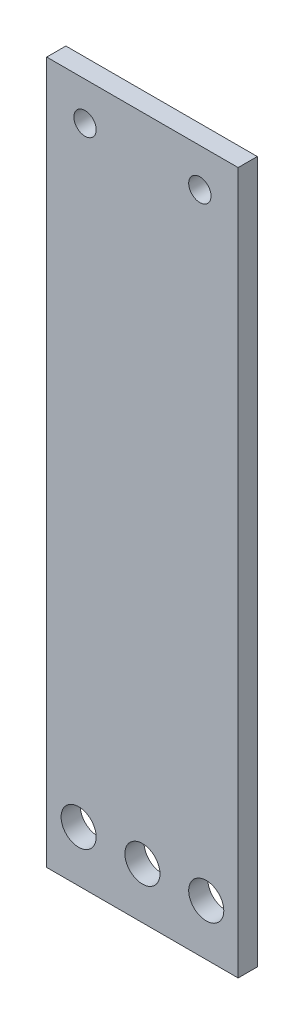
ISO-10303-21;
HEADER;
FILE_DESCRIPTION(('STEP AP214'),'2;1');
FILE_NAME('part.step','',(''),(''),'','','');
FILE_SCHEMA(('AUTOMOTIVE_DESIGN { 1 0 10303 214 1 1 1 1 }'));
ENDSEC;
DATA;
#1=APPLICATION_CONTEXT('core data for automotive mechanical design processes');
#2=APPLICATION_PROTOCOL_DEFINITION('international standard','automotive_design',2000,#1);
#3=PRODUCT_CONTEXT('',#1,'mechanical');
#4=PRODUCT('Part','Part','',(#3));
#5=PRODUCT_RELATED_PRODUCT_CATEGORY('part','',(#4));
#6=PRODUCT_DEFINITION_FORMATION('','',#4);
#7=PRODUCT_DEFINITION_CONTEXT('part definition',#1,'design');
#8=PRODUCT_DEFINITION('design','',#6,#7);
#9=PRODUCT_DEFINITION_SHAPE('','',#8);
#10=(LENGTH_UNIT() NAMED_UNIT(*) SI_UNIT(.MILLI.,.METRE.));
#11=(NAMED_UNIT(*) PLANE_ANGLE_UNIT() SI_UNIT($,.RADIAN.));
#12=(NAMED_UNIT(*) SI_UNIT($,.STERADIAN.) SOLID_ANGLE_UNIT());
#13=UNCERTAINTY_MEASURE_WITH_UNIT(LENGTH_MEASURE(1.E-05),#10,'distance_accuracy_value','');
#14=(GEOMETRIC_REPRESENTATION_CONTEXT(3) GLOBAL_UNCERTAINTY_ASSIGNED_CONTEXT((#13)) GLOBAL_UNIT_ASSIGNED_CONTEXT((#10,
#11,#12)) REPRESENTATION_CONTEXT('',''));
#15=CARTESIAN_POINT('',(0.,0.,0.));
#16=DIRECTION('',(0.,0.,1.));
#17=DIRECTION('',(1.,0.,0.));
#18=AXIS2_PLACEMENT_3D('',#15,#16,#17);
#19=CARTESIAN_POINT('',(0.,0.,3.));
#20=DIRECTION('',(0.,0.,-1.));
#21=DIRECTION('',(-1.,0.,0.));
#22=AXIS2_PLACEMENT_3D('',#19,#20,#21);
#23=PLANE('',#22);
#24=CARTESIAN_POINT('',(-9.,104.,3.));
#25=DIRECTION('',(0.,0.,1.));
#26=DIRECTION('',(1.,0.,0.));
#27=AXIS2_PLACEMENT_3D('',#24,#25,#26);
#28=CIRCLE('',#27,1.75);
#29=CARTESIAN_POINT('',(-7.25,104.,3.));
#30=VERTEX_POINT('',#29);
#31=EDGE_CURVE('E126',#30,#30,#28,.T.);
#32=ORIENTED_EDGE('',*,*,#31,.F.);
#33=EDGE_LOOP('',(#32));
#34=FACE_BOUND('',#33,.T.);
#35=CARTESIAN_POINT('',(0.,8.,3.));
#36=DIRECTION('',(0.,0.,1.));
#37=DIRECTION('',(1.,0.,0.));
#38=AXIS2_PLACEMENT_3D('',#35,#36,#37);
#39=CIRCLE('',#38,2.75);
#40=CARTESIAN_POINT('',(2.75000000000001,8.,3.));
#41=VERTEX_POINT('',#40);
#42=EDGE_CURVE('E114',#41,#41,#39,.T.);
#43=ORIENTED_EDGE('',*,*,#42,.F.);
#44=EDGE_LOOP('',(#43));
#45=FACE_BOUND('',#44,.T.);
#46=DIRECTION('',(0.,-1.,0.));
#47=VECTOR('',#46,1.);
#48=CARTESIAN_POINT('',(-15.,0.,3.));
#49=LINE('',#48,#47);
#50=CARTESIAN_POINT('',(-15.,110.,3.));
#51=VERTEX_POINT('',#50);
#52=CARTESIAN_POINT('',(-15.,0.,3.));
#53=VERTEX_POINT('',#52);
#54=EDGE_CURVE('E84',#51,#53,#49,.T.);
#55=ORIENTED_EDGE('',*,*,#54,.T.);
#56=DIRECTION('',(1.,0.,0.));
#57=VECTOR('',#56,1.);
#58=CARTESIAN_POINT('',(-15.,0.,3.));
#59=LINE('',#58,#57);
#60=CARTESIAN_POINT('',(15.,0.,3.));
#61=VERTEX_POINT('',#60);
#62=EDGE_CURVE('E79',#53,#61,#59,.T.);
#63=ORIENTED_EDGE('',*,*,#62,.T.);
#64=DIRECTION('',(0.,1.,0.));
#65=VECTOR('',#64,1.);
#66=CARTESIAN_POINT('',(15.,0.,3.));
#67=LINE('',#66,#65);
#68=CARTESIAN_POINT('',(15.,110.,3.));
#69=VERTEX_POINT('',#68);
#70=EDGE_CURVE('E82',#61,#69,#67,.T.);
#71=ORIENTED_EDGE('',*,*,#70,.T.);
#72=DIRECTION('',(-1.,0.,0.));
#73=VECTOR('',#72,1.);
#74=CARTESIAN_POINT('',(-15.,110.,3.));
#75=LINE('',#74,#73);
#76=EDGE_CURVE('E49',#69,#51,#75,.T.);
#77=ORIENTED_EDGE('',*,*,#76,.T.);
#78=EDGE_LOOP('',(#55,#63,#71,#77));
#79=FACE_BOUND('',#78,.T.);
#80=CARTESIAN_POINT('',(10.,8.,3.));
#81=DIRECTION('',(0.,0.,1.));
#82=DIRECTION('',(1.,0.,0.));
#83=AXIS2_PLACEMENT_3D('',#80,#81,#82);
#84=CIRCLE('',#83,2.75);
#85=CARTESIAN_POINT('',(12.75,8.,3.));
#86=VERTEX_POINT('',#85);
#87=EDGE_CURVE('E99',#86,#86,#84,.T.);
#88=ORIENTED_EDGE('',*,*,#87,.F.);
#89=EDGE_LOOP('',(#88));
#90=FACE_BOUND('',#89,.T.);
#91=CARTESIAN_POINT('',(-10.,8.,3.));
#92=DIRECTION('',(0.,0.,1.));
#93=DIRECTION('',(1.,0.,0.));
#94=AXIS2_PLACEMENT_3D('',#91,#92,#93);
#95=CIRCLE('',#94,2.75);
#96=CARTESIAN_POINT('',(-7.25,8.,3.));
#97=VERTEX_POINT('',#96);
#98=EDGE_CURVE('E120',#97,#97,#95,.T.);
#99=ORIENTED_EDGE('',*,*,#98,.F.);
#100=EDGE_LOOP('',(#99));
#101=FACE_BOUND('',#100,.T.);
#102=CARTESIAN_POINT('',(9.,104.,3.));
#103=DIRECTION('',(0.,0.,1.));
#104=DIRECTION('',(1.,0.,0.));
#105=AXIS2_PLACEMENT_3D('',#102,#103,#104);
#106=CIRCLE('',#105,1.75);
#107=CARTESIAN_POINT('',(10.75,104.,3.));
#108=VERTEX_POINT('',#107);
#109=EDGE_CURVE('E132',#108,#108,#106,.T.);
#110=ORIENTED_EDGE('',*,*,#109,.F.);
#111=EDGE_LOOP('',(#110));
#112=FACE_BOUND('',#111,.T.);
#113=ADVANCED_FACE('F32',(#34,#45,#79,#90,#101,#112),#23,.F.);
#114=CARTESIAN_POINT('',(0.,0.,0.));
#115=DIRECTION('',(0.,0.,-1.));
#116=DIRECTION('',(-1.,0.,0.));
#117=AXIS2_PLACEMENT_3D('',#114,#115,#116);
#118=PLANE('',#117);
#119=CARTESIAN_POINT('',(-9.,104.,0.));
#120=DIRECTION('',(0.,0.,1.));
#121=DIRECTION('',(1.,0.,0.));
#122=AXIS2_PLACEMENT_3D('',#119,#120,#121);
#123=CIRCLE('',#122,1.75);
#124=CARTESIAN_POINT('',(-7.25,104.,0.));
#125=VERTEX_POINT('',#124);
#126=EDGE_CURVE('E129',#125,#125,#123,.T.);
#127=ORIENTED_EDGE('',*,*,#126,.T.);
#128=EDGE_LOOP('',(#127));
#129=FACE_BOUND('',#128,.T.);
#130=CARTESIAN_POINT('',(0.,8.,0.));
#131=DIRECTION('',(0.,0.,1.));
#132=DIRECTION('',(1.,0.,0.));
#133=AXIS2_PLACEMENT_3D('',#130,#131,#132);
#134=CIRCLE('',#133,2.75);
#135=CARTESIAN_POINT('',(2.75000000000001,8.,0.));
#136=VERTEX_POINT('',#135);
#137=EDGE_CURVE('E117',#136,#136,#134,.T.);
#138=ORIENTED_EDGE('',*,*,#137,.T.);
#139=EDGE_LOOP('',(#138));
#140=FACE_BOUND('',#139,.T.);
#141=DIRECTION('',(0.,-1.,0.));
#142=VECTOR('',#141,1.);
#143=CARTESIAN_POINT('',(-15.,0.,0.));
#144=LINE('',#143,#142);
#145=CARTESIAN_POINT('',(-15.,110.,0.));
#146=VERTEX_POINT('',#145);
#147=CARTESIAN_POINT('',(-15.,0.,0.));
#148=VERTEX_POINT('',#147);
#149=EDGE_CURVE('E96',#146,#148,#144,.T.);
#150=ORIENTED_EDGE('',*,*,#149,.F.);
#151=DIRECTION('',(-1.,0.,0.));
#152=VECTOR('',#151,1.);
#153=CARTESIAN_POINT('',(-15.,110.,0.));
#154=LINE('',#153,#152);
#155=CARTESIAN_POINT('',(15.,110.,0.));
#156=VERTEX_POINT('',#155);
#157=EDGE_CURVE('E72',#156,#146,#154,.T.);
#158=ORIENTED_EDGE('',*,*,#157,.F.);
#159=DIRECTION('',(0.,1.,0.));
#160=VECTOR('',#159,1.);
#161=CARTESIAN_POINT('',(15.,0.,0.));
#162=LINE('',#161,#160);
#163=CARTESIAN_POINT('',(15.,0.,0.));
#164=VERTEX_POINT('',#163);
#165=EDGE_CURVE('E66',#164,#156,#162,.T.);
#166=ORIENTED_EDGE('',*,*,#165,.F.);
#167=DIRECTION('',(1.,0.,0.));
#168=VECTOR('',#167,1.);
#169=CARTESIAN_POINT('',(-15.,0.,0.));
#170=LINE('',#169,#168);
#171=EDGE_CURVE('E88',#148,#164,#170,.T.);
#172=ORIENTED_EDGE('',*,*,#171,.F.);
#173=EDGE_LOOP('',(#150,#158,#166,#172));
#174=FACE_BOUND('',#173,.T.);
#175=CARTESIAN_POINT('',(10.,8.,0.));
#176=DIRECTION('',(0.,0.,1.));
#177=DIRECTION('',(1.,0.,0.));
#178=AXIS2_PLACEMENT_3D('',#175,#176,#177);
#179=CIRCLE('',#178,2.75);
#180=CARTESIAN_POINT('',(12.75,8.,0.));
#181=VERTEX_POINT('',#180);
#182=EDGE_CURVE('E111',#181,#181,#179,.T.);
#183=ORIENTED_EDGE('',*,*,#182,.T.);
#184=EDGE_LOOP('',(#183));
#185=FACE_BOUND('',#184,.T.);
#186=CARTESIAN_POINT('',(-10.,8.,0.));
#187=DIRECTION('',(0.,0.,1.));
#188=DIRECTION('',(1.,0.,0.));
#189=AXIS2_PLACEMENT_3D('',#186,#187,#188);
#190=CIRCLE('',#189,2.75);
#191=CARTESIAN_POINT('',(-7.25,8.,0.));
#192=VERTEX_POINT('',#191);
#193=EDGE_CURVE('E123',#192,#192,#190,.T.);
#194=ORIENTED_EDGE('',*,*,#193,.T.);
#195=EDGE_LOOP('',(#194));
#196=FACE_BOUND('',#195,.T.);
#197=CARTESIAN_POINT('',(9.,104.,0.));
#198=DIRECTION('',(0.,0.,1.));
#199=DIRECTION('',(1.,0.,0.));
#200=AXIS2_PLACEMENT_3D('',#197,#198,#199);
#201=CIRCLE('',#200,1.75);
#202=CARTESIAN_POINT('',(10.75,104.,0.));
#203=VERTEX_POINT('',#202);
#204=EDGE_CURVE('E135',#203,#203,#201,.T.);
#205=ORIENTED_EDGE('',*,*,#204,.T.);
#206=EDGE_LOOP('',(#205));
#207=FACE_BOUND('',#206,.T.);
#208=ADVANCED_FACE('F107',(#129,#140,#174,#185,#196,#207),#118,.T.);
#209=CARTESIAN_POINT('',(-15.,0.,3.));
#210=DIRECTION('',(1.,0.,0.));
#211=DIRECTION('',(0.,0.,-1.));
#212=AXIS2_PLACEMENT_3D('',#209,#210,#211);
#213=PLANE('',#212);
#214=ORIENTED_EDGE('',*,*,#149,.T.);
#215=DIRECTION('',(0.,0.,-1.));
#216=VECTOR('',#215,1.);
#217=CARTESIAN_POINT('',(-15.,0.,3.));
#218=LINE('',#217,#216);
#219=EDGE_CURVE('E11',#53,#148,#218,.T.);
#220=ORIENTED_EDGE('',*,*,#219,.F.);
#221=ORIENTED_EDGE('',*,*,#54,.F.);
#222=DIRECTION('',(0.,0.,-1.));
#223=VECTOR('',#222,1.);
#224=CARTESIAN_POINT('',(-15.,110.,3.));
#225=LINE('',#224,#223);
#226=EDGE_CURVE('E92',#51,#146,#225,.T.);
#227=ORIENTED_EDGE('',*,*,#226,.T.);
#228=EDGE_LOOP('',(#214,#220,#221,#227));
#229=FACE_BOUND('',#228,.T.);
#230=ADVANCED_FACE('F34',(#229),#213,.F.);
#231=CARTESIAN_POINT('',(-15.,0.,3.));
#232=DIRECTION('',(0.,1.,0.));
#233=DIRECTION('',(0.,0.,1.));
#234=AXIS2_PLACEMENT_3D('',#231,#232,#233);
#235=PLANE('',#234);
#236=ORIENTED_EDGE('',*,*,#171,.T.);
#237=DIRECTION('',(0.,0.,-1.));
#238=VECTOR('',#237,1.);
#239=CARTESIAN_POINT('',(15.,0.,3.));
#240=LINE('',#239,#238);
#241=EDGE_CURVE('E41',#61,#164,#240,.T.);
#242=ORIENTED_EDGE('',*,*,#241,.F.);
#243=ORIENTED_EDGE('',*,*,#62,.F.);
#244=ORIENTED_EDGE('',*,*,#219,.T.);
#245=EDGE_LOOP('',(#236,#242,#243,#244));
#246=FACE_BOUND('',#245,.T.);
#247=ADVANCED_FACE('F87',(#246),#235,.F.);
#248=CARTESIAN_POINT('',(15.,0.,3.));
#249=DIRECTION('',(-1.,0.,0.));
#250=DIRECTION('',(0.,0.,1.));
#251=AXIS2_PLACEMENT_3D('',#248,#249,#250);
#252=PLANE('',#251);
#253=ORIENTED_EDGE('',*,*,#165,.T.);
#254=DIRECTION('',(0.,0.,-1.));
#255=VECTOR('',#254,1.);
#256=CARTESIAN_POINT('',(15.,110.,3.));
#257=LINE('',#256,#255);
#258=EDGE_CURVE('E89',#69,#156,#257,.T.);
#259=ORIENTED_EDGE('',*,*,#258,.F.);
#260=ORIENTED_EDGE('',*,*,#70,.F.);
#261=ORIENTED_EDGE('',*,*,#241,.T.);
#262=EDGE_LOOP('',(#253,#259,#260,#261));
#263=FACE_BOUND('',#262,.T.);
#264=ADVANCED_FACE('F90',(#263),#252,.F.);
#265=CARTESIAN_POINT('',(-15.,110.,3.));
#266=DIRECTION('',(0.,-1.,0.));
#267=DIRECTION('',(0.,0.,-1.));
#268=AXIS2_PLACEMENT_3D('',#265,#266,#267);
#269=PLANE('',#268);
#270=ORIENTED_EDGE('',*,*,#157,.T.);
#271=ORIENTED_EDGE('',*,*,#226,.F.);
#272=ORIENTED_EDGE('',*,*,#76,.F.);
#273=ORIENTED_EDGE('',*,*,#258,.T.);
#274=EDGE_LOOP('',(#270,#271,#272,#273));
#275=FACE_BOUND('',#274,.T.);
#276=ADVANCED_FACE('F104',(#275),#269,.F.);
#277=CARTESIAN_POINT('',(10.,8.,3.));
#278=DIRECTION('',(0.,0.,-1.));
#279=DIRECTION('',(-1.,0.,0.));
#280=AXIS2_PLACEMENT_3D('',#277,#278,#279);
#281=CYLINDRICAL_SURFACE('',#280,2.75);
#282=ORIENTED_EDGE('',*,*,#87,.T.);
#283=EDGE_LOOP('',(#282));
#284=FACE_BOUND('',#283,.T.);
#285=ORIENTED_EDGE('',*,*,#182,.F.);
#286=EDGE_LOOP('',(#285));
#287=FACE_BOUND('',#286,.T.);
#288=ADVANCED_FACE('F155',(#284,#287),#281,.F.);
#289=CARTESIAN_POINT('',(0.,8.,3.));
#290=DIRECTION('',(0.,0.,-1.));
#291=DIRECTION('',(-1.,0.,0.));
#292=AXIS2_PLACEMENT_3D('',#289,#290,#291);
#293=CYLINDRICAL_SURFACE('',#292,2.75);
#294=ORIENTED_EDGE('',*,*,#42,.T.);
#295=EDGE_LOOP('',(#294));
#296=FACE_BOUND('',#295,.T.);
#297=ORIENTED_EDGE('',*,*,#137,.F.);
#298=EDGE_LOOP('',(#297));
#299=FACE_BOUND('',#298,.T.);
#300=ADVANCED_FACE('F201',(#296,#299),#293,.F.);
#301=CARTESIAN_POINT('',(-10.,8.,3.));
#302=DIRECTION('',(0.,0.,-1.));
#303=DIRECTION('',(-1.,0.,0.));
#304=AXIS2_PLACEMENT_3D('',#301,#302,#303);
#305=CYLINDRICAL_SURFACE('',#304,2.75);
#306=ORIENTED_EDGE('',*,*,#98,.T.);
#307=EDGE_LOOP('',(#306));
#308=FACE_BOUND('',#307,.T.);
#309=ORIENTED_EDGE('',*,*,#193,.F.);
#310=EDGE_LOOP('',(#309));
#311=FACE_BOUND('',#310,.T.);
#312=ADVANCED_FACE('F209',(#308,#311),#305,.F.);
#313=CARTESIAN_POINT('',(-9.,104.,3.));
#314=DIRECTION('',(0.,0.,-1.));
#315=DIRECTION('',(-1.,0.,0.));
#316=AXIS2_PLACEMENT_3D('',#313,#314,#315);
#317=CYLINDRICAL_SURFACE('',#316,1.75);
#318=ORIENTED_EDGE('',*,*,#31,.T.);
#319=EDGE_LOOP('',(#318));
#320=FACE_BOUND('',#319,.T.);
#321=ORIENTED_EDGE('',*,*,#126,.F.);
#322=EDGE_LOOP('',(#321));
#323=FACE_BOUND('',#322,.T.);
#324=ADVANCED_FACE('F217',(#320,#323),#317,.F.);
#325=CARTESIAN_POINT('',(9.,104.,3.));
#326=DIRECTION('',(0.,0.,-1.));
#327=DIRECTION('',(-1.,0.,0.));
#328=AXIS2_PLACEMENT_3D('',#325,#326,#327);
#329=CYLINDRICAL_SURFACE('',#328,1.75);
#330=ORIENTED_EDGE('',*,*,#109,.T.);
#331=EDGE_LOOP('',(#330));
#332=FACE_BOUND('',#331,.T.);
#333=ORIENTED_EDGE('',*,*,#204,.F.);
#334=EDGE_LOOP('',(#333));
#335=FACE_BOUND('',#334,.T.);
#336=ADVANCED_FACE('F141',(#332,#335),#329,.F.);
#337=CLOSED_SHELL('',(#113,#208,#230,#247,#264,#276,#288,#300,#312,#324,#336));
#338=MANIFOLD_SOLID_BREP('B2',#337);
#339=ADVANCED_BREP_SHAPE_REPRESENTATION('',(#18,#338),#14);
#340=SHAPE_DEFINITION_REPRESENTATION(#9,#339);
ENDSEC;
END-ISO-10303-21;
